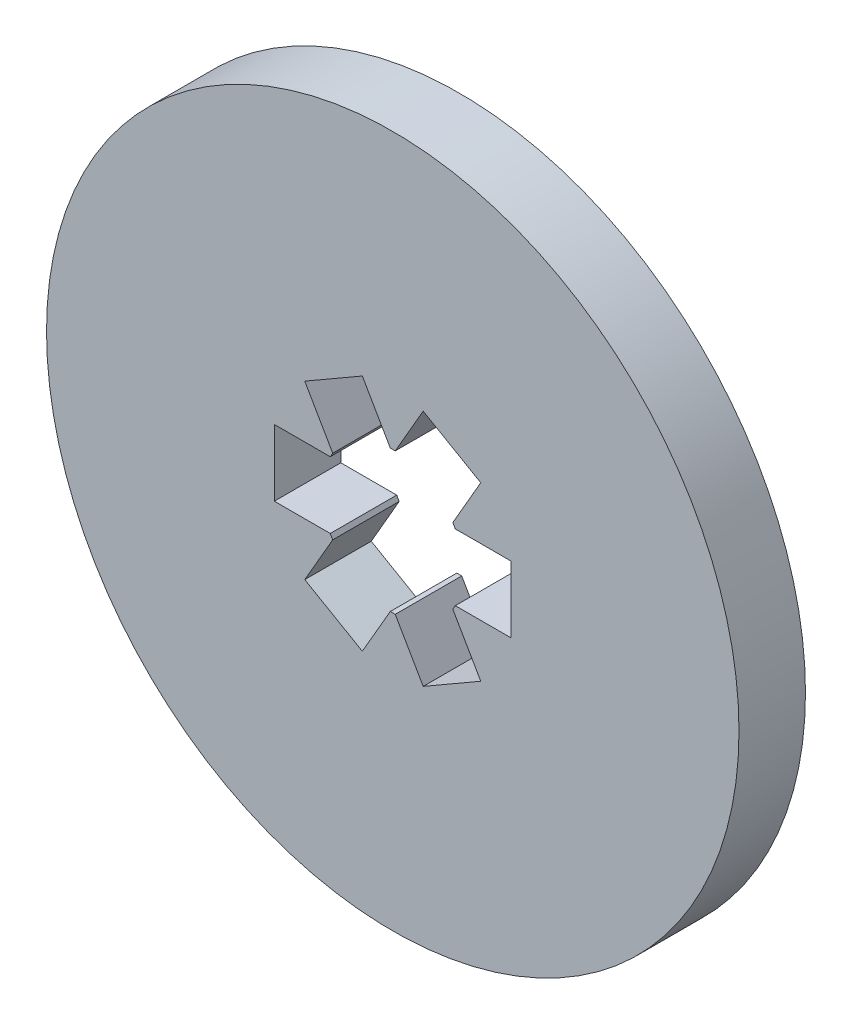
ISO-10303-21;
HEADER;
FILE_DESCRIPTION(('STEP AP214'),'2;1');
FILE_NAME('part.step','',(''),(''),'','','');
FILE_SCHEMA(('AUTOMOTIVE_DESIGN { 1 0 10303 214 1 1 1 1 }'));
ENDSEC;
DATA;
#1=APPLICATION_CONTEXT('core data for automotive mechanical design processes');
#2=APPLICATION_PROTOCOL_DEFINITION('international standard','automotive_design',2000,#1);
#3=PRODUCT_CONTEXT('',#1,'mechanical');
#4=PRODUCT('Part','Part','',(#3));
#5=PRODUCT_RELATED_PRODUCT_CATEGORY('part','',(#4));
#6=PRODUCT_DEFINITION_FORMATION('','',#4);
#7=PRODUCT_DEFINITION_CONTEXT('part definition',#1,'design');
#8=PRODUCT_DEFINITION('design','',#6,#7);
#9=PRODUCT_DEFINITION_SHAPE('','',#8);
#10=(LENGTH_UNIT() NAMED_UNIT(*) SI_UNIT(.MILLI.,.METRE.));
#11=(NAMED_UNIT(*) PLANE_ANGLE_UNIT() SI_UNIT($,.RADIAN.));
#12=(NAMED_UNIT(*) SI_UNIT($,.STERADIAN.) SOLID_ANGLE_UNIT());
#13=UNCERTAINTY_MEASURE_WITH_UNIT(LENGTH_MEASURE(1.E-05),#10,'distance_accuracy_value','');
#14=(GEOMETRIC_REPRESENTATION_CONTEXT(3) GLOBAL_UNCERTAINTY_ASSIGNED_CONTEXT((#13)) GLOBAL_UNIT_ASSIGNED_CONTEXT((#10,
#11,#12)) REPRESENTATION_CONTEXT('',''));
#15=CARTESIAN_POINT('',(0.,0.,0.));
#16=DIRECTION('',(0.,0.,1.));
#17=DIRECTION('',(1.,0.,0.));
#18=AXIS2_PLACEMENT_3D('',#15,#16,#17);
#19=CARTESIAN_POINT('',(107.492585866147,-0.762000000000165,1.524));
#20=DIRECTION('',(0.,0.,1.));
#21=DIRECTION('',(1.,0.,0.));
#22=AXIS2_PLACEMENT_3D('',#19,#20,#21);
#23=PLANE('',#22);
#24=CARTESIAN_POINT('',(107.492585866147,-0.762000000000165,1.524));
#25=DIRECTION('',(0.,0.,1.));
#26=DIRECTION('',(1.,0.,0.));
#27=AXIS2_PLACEMENT_3D('',#24,#25,#26);
#28=CIRCLE('',#27,7.93749999999999);
#29=CARTESIAN_POINT('',(99.5550858661466,-0.762000000000165,1.524));
#30=VERTEX_POINT('',#29);
#31=EDGE_CURVE('E11',#30,#30,#28,.T.);
#32=ORIENTED_EDGE('',*,*,#31,.T.);
#33=EDGE_LOOP('',(#32));
#34=FACE_BOUND('',#33,.T.);
#35=DIRECTION('',(-0.500000000001559,0.866025403783539,0.));
#36=VECTOR('',#35,1.);
#37=CARTESIAN_POINT('',(108.869130968628,0.0982460564084853,1.524));
#38=LINE('',#37,#36);
#39=CARTESIAN_POINT('',(108.925853355743,0.,1.524));
#40=VERTEX_POINT('',#39);
#41=CARTESIAN_POINT('',(108.869130968628,0.0982460564084853,1.524));
#42=VERTEX_POINT('',#41);
#43=EDGE_CURVE('E201',#40,#42,#38,.T.);
#44=ORIENTED_EDGE('',*,*,#43,.F.);
#45=DIRECTION('',(-1.,0.,0.));
#46=VECTOR('',#45,1.);
#47=CARTESIAN_POINT('',(108.925853355743,0.,1.524));
#48=LINE('',#47,#46);
#49=CARTESIAN_POINT('',(110.207675722449,0.,1.524));
#50=VERTEX_POINT('',#49);
#51=EDGE_CURVE('E193',#50,#40,#48,.T.);
#52=ORIENTED_EDGE('',*,*,#51,.F.);
#53=DIRECTION('',(0.,1.,0.));
#54=VECTOR('',#53,1.);
#55=CARTESIAN_POINT('',(110.207675722449,0.,1.524));
#56=LINE('',#55,#54);
#57=CARTESIAN_POINT('',(110.207675722449,-1.52399999999999,1.524));
#58=VERTEX_POINT('',#57);
#59=EDGE_CURVE('E257',#58,#50,#56,.T.);
#60=ORIENTED_EDGE('',*,*,#59,.F.);
#61=DIRECTION('',(1.,0.,0.));
#62=VECTOR('',#61,1.);
#63=CARTESIAN_POINT('',(110.207675722449,-1.52399999999999,1.524));
#64=LINE('',#63,#62);
#65=CARTESIAN_POINT('',(108.925853355743,-1.52399999999999,1.524));
#66=VERTEX_POINT('',#65);
#67=EDGE_CURVE('E255',#66,#58,#64,.T.);
#68=ORIENTED_EDGE('',*,*,#67,.F.);
#69=DIRECTION('',(0.499999999998682,0.866025403785199,0.));
#70=VECTOR('',#69,1.);
#71=CARTESIAN_POINT('',(108.925853355743,-1.52399999999999,1.524));
#72=LINE('',#71,#70);
#73=CARTESIAN_POINT('',(108.869130968628,-1.62224605640869,1.524));
#74=VERTEX_POINT('',#73);
#75=EDGE_CURVE('E253',#74,#66,#72,.T.);
#76=ORIENTED_EDGE('',*,*,#75,.F.);
#77=DIRECTION('',(-0.499999999999997,0.866025403784441,0.));
#78=VECTOR('',#77,1.);
#79=CARTESIAN_POINT('',(108.869130968628,-1.62224605640869,1.524));
#80=LINE('',#79,#78);
#81=CARTESIAN_POINT('',(109.510042151982,-2.7323367891159,1.524));
#82=VERTEX_POINT('',#81);
#83=EDGE_CURVE('E251',#82,#74,#80,.T.);
#84=ORIENTED_EDGE('',*,*,#83,.F.);
#85=DIRECTION('',(0.866025403784439,0.499999999999999,0.));
#86=VECTOR('',#85,1.);
#87=CARTESIAN_POINT('',(109.510042151982,-2.7323367891159,1.524));
#88=LINE('',#87,#86);
#89=CARTESIAN_POINT('',(108.190219436614,-3.4943367891159,1.524));
#90=VERTEX_POINT('',#89);
#91=EDGE_CURVE('E249',#90,#82,#88,.T.);
#92=ORIENTED_EDGE('',*,*,#91,.F.);
#93=DIRECTION('',(0.499999999999997,-0.866025403784441,0.));
#94=VECTOR('',#93,1.);
#95=CARTESIAN_POINT('',(108.190219436614,-3.4943367891159,1.524));
#96=LINE('',#95,#94);
#97=CARTESIAN_POINT('',(107.549308253261,-2.38424605640869,1.524));
#98=VERTEX_POINT('',#97);
#99=EDGE_CURVE('E247',#98,#90,#96,.T.);
#100=ORIENTED_EDGE('',*,*,#99,.F.);
#101=DIRECTION('',(1.,1.59030015025616E-12,0.));
#102=VECTOR('',#101,1.);
#103=CARTESIAN_POINT('',(107.549308253261,-2.38424605640869,1.524));
#104=LINE('',#103,#102);
#105=CARTESIAN_POINT('',(107.435863479032,-2.38424605640887,1.524));
#106=VERTEX_POINT('',#105);
#107=EDGE_CURVE('E245',#106,#98,#104,.T.);
#108=ORIENTED_EDGE('',*,*,#107,.F.);
#109=DIRECTION('',(0.500000000000001,0.866025403784438,0.));
#110=VECTOR('',#109,1.);
#111=CARTESIAN_POINT('',(107.435863479032,-2.38424605640887,1.524));
#112=LINE('',#111,#110);
#113=CARTESIAN_POINT('',(106.794952295679,-3.49433678911606,1.524));
#114=VERTEX_POINT('',#113);
#115=EDGE_CURVE('E243',#114,#106,#112,.T.);
#116=ORIENTED_EDGE('',*,*,#115,.F.);
#117=DIRECTION('',(0.866025403784433,-0.50000000000001,0.));
#118=VECTOR('',#117,1.);
#119=CARTESIAN_POINT('',(106.794952295679,-3.49433678911606,1.524));
#120=LINE('',#119,#118);
#121=CARTESIAN_POINT('',(105.475129580311,-2.73233678911605,1.524));
#122=VERTEX_POINT('',#121);
#123=EDGE_CURVE('E241',#122,#114,#120,.T.);
#124=ORIENTED_EDGE('',*,*,#123,.F.);
#125=DIRECTION('',(-0.500000000000001,-0.866025403784438,0.));
#126=VECTOR('',#125,1.);
#127=CARTESIAN_POINT('',(105.475129580311,-2.73233678911605,1.524));
#128=LINE('',#127,#126);
#129=CARTESIAN_POINT('',(106.116040763665,-1.62224605640886,1.524));
#130=VERTEX_POINT('',#129);
#131=EDGE_CURVE('E239',#130,#122,#128,.T.);
#132=ORIENTED_EDGE('',*,*,#131,.F.);
#133=DIRECTION('',(0.500000000001185,-0.866025403783754,0.));
#134=VECTOR('',#133,1.);
#135=CARTESIAN_POINT('',(106.116040763665,-1.62224605640886,1.524));
#136=LINE('',#135,#134);
#137=CARTESIAN_POINT('',(106.05931837655,-1.52400000000036,1.524));
#138=VERTEX_POINT('',#137);
#139=EDGE_CURVE('E237',#138,#130,#136,.T.);
#140=ORIENTED_EDGE('',*,*,#139,.F.);
#141=DIRECTION('',(1.,0.,0.));
#142=VECTOR('',#141,1.);
#143=CARTESIAN_POINT('',(106.05931837655,-1.52400000000036,1.524));
#144=LINE('',#143,#142);
#145=CARTESIAN_POINT('',(104.777496009844,-1.52400000000037,1.524));
#146=VERTEX_POINT('',#145);
#147=EDGE_CURVE('E235',#146,#138,#144,.T.);
#148=ORIENTED_EDGE('',*,*,#147,.F.);
#149=DIRECTION('',(0.,-1.,0.));
#150=VECTOR('',#149,1.);
#151=CARTESIAN_POINT('',(104.777496009844,-1.52400000000037,1.524));
#152=LINE('',#151,#150);
#153=CARTESIAN_POINT('',(104.777496009844,-3.64725610824124E-13,1.524));
#154=VERTEX_POINT('',#153);
#155=EDGE_CURVE('E233',#154,#146,#152,.T.);
#156=ORIENTED_EDGE('',*,*,#155,.F.);
#157=DIRECTION('',(-1.,0.,0.));
#158=VECTOR('',#157,1.);
#159=CARTESIAN_POINT('',(104.777496009844,-3.64725610824124E-13,1.524));
#160=LINE('',#159,#158);
#161=CARTESIAN_POINT('',(106.05931837655,-3.55618312575245E-13,1.524));
#162=VERTEX_POINT('',#161);
#163=EDGE_CURVE('E231',#162,#154,#160,.T.);
#164=ORIENTED_EDGE('',*,*,#163,.F.);
#165=DIRECTION('',(-0.499999999998743,-0.866025403785164,0.));
#166=VECTOR('',#165,1.);
#167=CARTESIAN_POINT('',(106.05931837655,-3.55618312575245E-13,1.524));
#168=LINE('',#167,#166);
#169=CARTESIAN_POINT('',(106.116040763665,0.0982460564083049,1.524));
#170=VERTEX_POINT('',#169);
#171=EDGE_CURVE('E229',#170,#162,#168,.T.);
#172=ORIENTED_EDGE('',*,*,#171,.F.);
#173=DIRECTION('',(0.500000000000001,-0.866025403784438,0.));
#174=VECTOR('',#173,1.);
#175=CARTESIAN_POINT('',(106.116040763665,0.0982460564083049,1.524));
#176=LINE('',#175,#174);
#177=CARTESIAN_POINT('',(105.475129580311,1.2083367891155,1.524));
#178=VERTEX_POINT('',#177);
#179=EDGE_CURVE('E227',#178,#170,#176,.T.);
#180=ORIENTED_EDGE('',*,*,#179,.F.);
#181=DIRECTION('',(-0.866025403784435,-0.500000000000006,0.));
#182=VECTOR('',#181,1.);
#183=CARTESIAN_POINT('',(105.475129580311,1.2083367891155,1.524));
#184=LINE('',#183,#182);
#185=CARTESIAN_POINT('',(106.794952295679,1.97033678911551,1.524));
#186=VERTEX_POINT('',#185);
#187=EDGE_CURVE('E225',#186,#178,#184,.T.);
#188=ORIENTED_EDGE('',*,*,#187,.F.);
#189=DIRECTION('',(-0.500000000000001,0.866025403784438,0.));
#190=VECTOR('',#189,1.);
#191=CARTESIAN_POINT('',(106.794952295679,1.97033678911551,1.524));
#192=LINE('',#191,#190);
#193=CARTESIAN_POINT('',(107.435863479032,0.860246056408318,1.524));
#194=VERTEX_POINT('',#193);
#195=EDGE_CURVE('E223',#194,#186,#192,.T.);
#196=ORIENTED_EDGE('',*,*,#195,.F.);
#197=DIRECTION('',(-1.,-1.46796936946758E-12,0.));
#198=VECTOR('',#197,1.);
#199=CARTESIAN_POINT('',(107.435863479032,0.860246056408318,1.524));
#200=LINE('',#199,#198);
#201=CARTESIAN_POINT('',(107.549308253261,0.860246056408484,1.524));
#202=VERTEX_POINT('',#201);
#203=EDGE_CURVE('E221',#202,#194,#200,.T.);
#204=ORIENTED_EDGE('',*,*,#203,.F.);
#205=DIRECTION('',(-0.499999999999997,-0.866025403784441,0.));
#206=VECTOR('',#205,1.);
#207=CARTESIAN_POINT('',(107.549308253261,0.860246056408484,1.524));
#208=LINE('',#207,#206);
#209=CARTESIAN_POINT('',(108.190219436614,1.97033678911569,1.524));
#210=VERTEX_POINT('',#209);
#211=EDGE_CURVE('E219',#210,#202,#208,.T.);
#212=ORIENTED_EDGE('',*,*,#211,.F.);
#213=DIRECTION('',(-0.866025403784439,0.499999999999999,0.));
#214=VECTOR('',#213,1.);
#215=CARTESIAN_POINT('',(108.190219436614,1.97033678911569,1.524));
#216=LINE('',#215,#214);
#217=CARTESIAN_POINT('',(109.510042151982,1.20833678911569,1.524));
#218=VERTEX_POINT('',#217);
#219=EDGE_CURVE('E215',#218,#210,#216,.T.);
#220=ORIENTED_EDGE('',*,*,#219,.F.);
#221=DIRECTION('',(0.499999999999997,0.866025403784441,0.));
#222=VECTOR('',#221,1.);
#223=CARTESIAN_POINT('',(109.510042151982,1.20833678911569,1.524));
#224=LINE('',#223,#222);
#225=EDGE_CURVE('E213',#42,#218,#224,.T.);
#226=ORIENTED_EDGE('',*,*,#225,.F.);
#227=EDGE_LOOP('',(#44,#52,#60,#68,#76,#84,#92,#100,#108,#116,#124,#132,#140,#148,#156,#164,
#172,#180,#188,#196,#204,#212,#220,#226));
#228=FACE_BOUND('',#227,.T.);
#229=ADVANCED_FACE('F32',(#34,#228),#23,.T.);
#230=CARTESIAN_POINT('',(107.492585866147,-0.762000000000165,0.));
#231=DIRECTION('',(0.,0.,1.));
#232=DIRECTION('',(1.,0.,0.));
#233=AXIS2_PLACEMENT_3D('',#230,#231,#232);
#234=PLANE('',#233);
#235=CARTESIAN_POINT('',(107.492585866147,-0.762000000000165,0.));
#236=DIRECTION('',(0.,0.,1.));
#237=DIRECTION('',(1.,0.,0.));
#238=AXIS2_PLACEMENT_3D('',#235,#236,#237);
#239=CIRCLE('',#238,7.93749999999999);
#240=CARTESIAN_POINT('',(99.5550858661466,-0.762000000000165,0.));
#241=VERTEX_POINT('',#240);
#242=EDGE_CURVE('E36',#241,#241,#239,.T.);
#243=ORIENTED_EDGE('',*,*,#242,.F.);
#244=EDGE_LOOP('',(#243));
#245=FACE_BOUND('',#244,.T.);
#246=DIRECTION('',(-1.,0.,0.));
#247=VECTOR('',#246,1.);
#248=CARTESIAN_POINT('',(108.925853355743,0.,0.));
#249=LINE('',#248,#247);
#250=CARTESIAN_POINT('',(110.207675722449,0.,0.));
#251=VERTEX_POINT('',#250);
#252=CARTESIAN_POINT('',(108.925853355743,0.,0.));
#253=VERTEX_POINT('',#252);
#254=EDGE_CURVE('E55',#251,#253,#249,.T.);
#255=ORIENTED_EDGE('',*,*,#254,.T.);
#256=DIRECTION('',(-0.500000000001559,0.866025403783539,0.));
#257=VECTOR('',#256,1.);
#258=CARTESIAN_POINT('',(108.869130968628,0.0982460564084853,0.));
#259=LINE('',#258,#257);
#260=CARTESIAN_POINT('',(108.869130968628,0.0982460564084853,0.));
#261=VERTEX_POINT('',#260);
#262=EDGE_CURVE('E208',#253,#261,#259,.T.);
#263=ORIENTED_EDGE('',*,*,#262,.T.);
#264=DIRECTION('',(0.499999999999997,0.866025403784441,0.));
#265=VECTOR('',#264,1.);
#266=CARTESIAN_POINT('',(109.510042151982,1.20833678911569,0.));
#267=LINE('',#266,#265);
#268=CARTESIAN_POINT('',(109.510042151982,1.20833678911569,0.));
#269=VERTEX_POINT('',#268);
#270=EDGE_CURVE('E261',#261,#269,#267,.T.);
#271=ORIENTED_EDGE('',*,*,#270,.T.);
#272=DIRECTION('',(-0.866025403784439,0.499999999999999,0.));
#273=VECTOR('',#272,1.);
#274=CARTESIAN_POINT('',(108.190219436614,1.97033678911569,0.));
#275=LINE('',#274,#273);
#276=CARTESIAN_POINT('',(108.190219436614,1.97033678911569,0.));
#277=VERTEX_POINT('',#276);
#278=EDGE_CURVE('E264',#269,#277,#275,.T.);
#279=ORIENTED_EDGE('',*,*,#278,.T.);
#280=DIRECTION('',(-0.499999999999997,-0.866025403784441,0.));
#281=VECTOR('',#280,1.);
#282=CARTESIAN_POINT('',(107.549308253261,0.860246056408484,0.));
#283=LINE('',#282,#281);
#284=CARTESIAN_POINT('',(107.549308253261,0.860246056408484,0.));
#285=VERTEX_POINT('',#284);
#286=EDGE_CURVE('E267',#277,#285,#283,.T.);
#287=ORIENTED_EDGE('',*,*,#286,.T.);
#288=DIRECTION('',(-1.,-1.46796936946758E-12,0.));
#289=VECTOR('',#288,1.);
#290=CARTESIAN_POINT('',(107.435863479032,0.860246056408318,0.));
#291=LINE('',#290,#289);
#292=CARTESIAN_POINT('',(107.435863479032,0.860246056408318,0.));
#293=VERTEX_POINT('',#292);
#294=EDGE_CURVE('E270',#285,#293,#291,.T.);
#295=ORIENTED_EDGE('',*,*,#294,.T.);
#296=DIRECTION('',(-0.500000000000001,0.866025403784438,0.));
#297=VECTOR('',#296,1.);
#298=CARTESIAN_POINT('',(106.794952295679,1.97033678911551,0.));
#299=LINE('',#298,#297);
#300=CARTESIAN_POINT('',(106.794952295679,1.97033678911551,0.));
#301=VERTEX_POINT('',#300);
#302=EDGE_CURVE('E273',#293,#301,#299,.T.);
#303=ORIENTED_EDGE('',*,*,#302,.T.);
#304=DIRECTION('',(-0.866025403784435,-0.500000000000006,0.));
#305=VECTOR('',#304,1.);
#306=CARTESIAN_POINT('',(105.475129580311,1.2083367891155,0.));
#307=LINE('',#306,#305);
#308=CARTESIAN_POINT('',(105.475129580311,1.2083367891155,0.));
#309=VERTEX_POINT('',#308);
#310=EDGE_CURVE('E276',#301,#309,#307,.T.);
#311=ORIENTED_EDGE('',*,*,#310,.T.);
#312=DIRECTION('',(0.500000000000001,-0.866025403784438,0.));
#313=VECTOR('',#312,1.);
#314=CARTESIAN_POINT('',(106.116040763665,0.0982460564083049,0.));
#315=LINE('',#314,#313);
#316=CARTESIAN_POINT('',(106.116040763665,0.0982460564083049,0.));
#317=VERTEX_POINT('',#316);
#318=EDGE_CURVE('E279',#309,#317,#315,.T.);
#319=ORIENTED_EDGE('',*,*,#318,.T.);
#320=DIRECTION('',(-0.499999999998743,-0.866025403785164,0.));
#321=VECTOR('',#320,1.);
#322=CARTESIAN_POINT('',(106.05931837655,-3.55618312575245E-13,0.));
#323=LINE('',#322,#321);
#324=CARTESIAN_POINT('',(106.05931837655,-3.55618312575245E-13,0.));
#325=VERTEX_POINT('',#324);
#326=EDGE_CURVE('E282',#317,#325,#323,.T.);
#327=ORIENTED_EDGE('',*,*,#326,.T.);
#328=DIRECTION('',(-1.,0.,0.));
#329=VECTOR('',#328,1.);
#330=CARTESIAN_POINT('',(104.777496009844,-3.64725610824124E-13,0.));
#331=LINE('',#330,#329);
#332=CARTESIAN_POINT('',(104.777496009844,-3.64725610824124E-13,0.));
#333=VERTEX_POINT('',#332);
#334=EDGE_CURVE('E285',#325,#333,#331,.T.);
#335=ORIENTED_EDGE('',*,*,#334,.T.);
#336=DIRECTION('',(0.,-1.,0.));
#337=VECTOR('',#336,1.);
#338=CARTESIAN_POINT('',(104.777496009844,-1.52400000000037,0.));
#339=LINE('',#338,#337);
#340=CARTESIAN_POINT('',(104.777496009844,-1.52400000000037,0.));
#341=VERTEX_POINT('',#340);
#342=EDGE_CURVE('E288',#333,#341,#339,.T.);
#343=ORIENTED_EDGE('',*,*,#342,.T.);
#344=DIRECTION('',(1.,0.,0.));
#345=VECTOR('',#344,1.);
#346=CARTESIAN_POINT('',(106.05931837655,-1.52400000000036,0.));
#347=LINE('',#346,#345);
#348=CARTESIAN_POINT('',(106.05931837655,-1.52400000000036,0.));
#349=VERTEX_POINT('',#348);
#350=EDGE_CURVE('E291',#341,#349,#347,.T.);
#351=ORIENTED_EDGE('',*,*,#350,.T.);
#352=DIRECTION('',(0.500000000001185,-0.866025403783754,0.));
#353=VECTOR('',#352,1.);
#354=CARTESIAN_POINT('',(106.116040763665,-1.62224605640886,0.));
#355=LINE('',#354,#353);
#356=CARTESIAN_POINT('',(106.116040763665,-1.62224605640886,0.));
#357=VERTEX_POINT('',#356);
#358=EDGE_CURVE('E294',#349,#357,#355,.T.);
#359=ORIENTED_EDGE('',*,*,#358,.T.);
#360=DIRECTION('',(-0.500000000000001,-0.866025403784438,0.));
#361=VECTOR('',#360,1.);
#362=CARTESIAN_POINT('',(105.475129580311,-2.73233678911605,0.));
#363=LINE('',#362,#361);
#364=CARTESIAN_POINT('',(105.475129580311,-2.73233678911605,0.));
#365=VERTEX_POINT('',#364);
#366=EDGE_CURVE('E297',#357,#365,#363,.T.);
#367=ORIENTED_EDGE('',*,*,#366,.T.);
#368=DIRECTION('',(0.866025403784433,-0.50000000000001,0.));
#369=VECTOR('',#368,1.);
#370=CARTESIAN_POINT('',(106.794952295679,-3.49433678911606,0.));
#371=LINE('',#370,#369);
#372=CARTESIAN_POINT('',(106.794952295679,-3.49433678911606,0.));
#373=VERTEX_POINT('',#372);
#374=EDGE_CURVE('E300',#365,#373,#371,.T.);
#375=ORIENTED_EDGE('',*,*,#374,.T.);
#376=DIRECTION('',(0.500000000000001,0.866025403784438,0.));
#377=VECTOR('',#376,1.);
#378=CARTESIAN_POINT('',(107.435863479032,-2.38424605640887,0.));
#379=LINE('',#378,#377);
#380=CARTESIAN_POINT('',(107.435863479032,-2.38424605640887,0.));
#381=VERTEX_POINT('',#380);
#382=EDGE_CURVE('E303',#373,#381,#379,.T.);
#383=ORIENTED_EDGE('',*,*,#382,.T.);
#384=DIRECTION('',(1.,1.59030015025616E-12,0.));
#385=VECTOR('',#384,1.);
#386=CARTESIAN_POINT('',(107.549308253261,-2.38424605640869,0.));
#387=LINE('',#386,#385);
#388=CARTESIAN_POINT('',(107.549308253261,-2.38424605640869,0.));
#389=VERTEX_POINT('',#388);
#390=EDGE_CURVE('E306',#381,#389,#387,.T.);
#391=ORIENTED_EDGE('',*,*,#390,.T.);
#392=DIRECTION('',(0.499999999999997,-0.866025403784441,0.));
#393=VECTOR('',#392,1.);
#394=CARTESIAN_POINT('',(108.190219436614,-3.4943367891159,0.));
#395=LINE('',#394,#393);
#396=CARTESIAN_POINT('',(108.190219436614,-3.4943367891159,0.));
#397=VERTEX_POINT('',#396);
#398=EDGE_CURVE('E309',#389,#397,#395,.T.);
#399=ORIENTED_EDGE('',*,*,#398,.T.);
#400=DIRECTION('',(0.866025403784439,0.499999999999999,0.));
#401=VECTOR('',#400,1.);
#402=CARTESIAN_POINT('',(109.510042151982,-2.7323367891159,0.));
#403=LINE('',#402,#401);
#404=CARTESIAN_POINT('',(109.510042151982,-2.7323367891159,0.));
#405=VERTEX_POINT('',#404);
#406=EDGE_CURVE('E312',#397,#405,#403,.T.);
#407=ORIENTED_EDGE('',*,*,#406,.T.);
#408=DIRECTION('',(-0.499999999999997,0.866025403784441,0.));
#409=VECTOR('',#408,1.);
#410=CARTESIAN_POINT('',(108.869130968628,-1.62224605640869,0.));
#411=LINE('',#410,#409);
#412=CARTESIAN_POINT('',(108.869130968628,-1.62224605640869,0.));
#413=VERTEX_POINT('',#412);
#414=EDGE_CURVE('E315',#405,#413,#411,.T.);
#415=ORIENTED_EDGE('',*,*,#414,.T.);
#416=DIRECTION('',(0.499999999998682,0.866025403785199,0.));
#417=VECTOR('',#416,1.);
#418=CARTESIAN_POINT('',(108.925853355743,-1.52399999999999,0.));
#419=LINE('',#418,#417);
#420=CARTESIAN_POINT('',(108.925853355743,-1.52399999999999,0.));
#421=VERTEX_POINT('',#420);
#422=EDGE_CURVE('E318',#413,#421,#419,.T.);
#423=ORIENTED_EDGE('',*,*,#422,.T.);
#424=DIRECTION('',(1.,0.,0.));
#425=VECTOR('',#424,1.);
#426=CARTESIAN_POINT('',(110.207675722449,-1.52399999999999,0.));
#427=LINE('',#426,#425);
#428=CARTESIAN_POINT('',(110.207675722449,-1.52399999999999,0.));
#429=VERTEX_POINT('',#428);
#430=EDGE_CURVE('E321',#421,#429,#427,.T.);
#431=ORIENTED_EDGE('',*,*,#430,.T.);
#432=DIRECTION('',(0.,1.,0.));
#433=VECTOR('',#432,1.);
#434=CARTESIAN_POINT('',(110.207675722449,0.,0.));
#435=LINE('',#434,#433);
#436=EDGE_CURVE('E202',#429,#251,#435,.T.);
#437=ORIENTED_EDGE('',*,*,#436,.T.);
#438=EDGE_LOOP('',(#255,#263,#271,#279,#287,#295,#303,#311,#319,#327,#335,#343,#351,#359,#367,
#375,#383,#391,#399,#407,#415,#423,#431,#437));
#439=FACE_BOUND('',#438,.T.);
#440=ADVANCED_FACE('F374',(#245,#439),#234,.F.);
#441=CARTESIAN_POINT('',(107.492585866147,-0.762000000000165,1.524));
#442=DIRECTION('',(0.,0.,-1.));
#443=DIRECTION('',(-1.,0.,0.));
#444=AXIS2_PLACEMENT_3D('',#441,#442,#443);
#445=CYLINDRICAL_SURFACE('',#444,7.93749999999999);
#446=CARTESIAN_POINT('',(99.5550858661466,-0.762000000000165,1.524));
#447=CARTESIAN_POINT('',(99.5550858661466,-0.762000000000165,1.508125));
#448=CARTESIAN_POINT('',(99.5550858661466,-0.762000000000165,1.49225));
#449=CARTESIAN_POINT('',(99.5550858661466,-0.762000000000165,1.4605));
#450=CARTESIAN_POINT('',(99.5550858661466,-0.762000000000165,1.444625));
#451=CARTESIAN_POINT('',(99.5550858661466,-0.762000000000165,1.412875));
#452=CARTESIAN_POINT('',(99.5550858661466,-0.762000000000165,1.397));
#453=CARTESIAN_POINT('',(99.5550858661466,-0.762000000000165,1.36525));
#454=CARTESIAN_POINT('',(99.5550858661466,-0.762000000000165,1.349375));
#455=CARTESIAN_POINT('',(99.5550858661466,-0.762000000000165,1.317625));
#456=CARTESIAN_POINT('',(99.5550858661466,-0.762000000000165,1.30175));
#457=CARTESIAN_POINT('',(99.5550858661466,-0.762000000000165,1.27));
#458=CARTESIAN_POINT('',(99.5550858661466,-0.762000000000165,1.254125));
#459=CARTESIAN_POINT('',(99.5550858661466,-0.762000000000165,1.222375));
#460=CARTESIAN_POINT('',(99.5550858661466,-0.762000000000165,1.2065));
#461=CARTESIAN_POINT('',(99.5550858661466,-0.762000000000165,1.17475));
#462=CARTESIAN_POINT('',(99.5550858661466,-0.762000000000165,1.158875));
#463=CARTESIAN_POINT('',(99.5550858661466,-0.762000000000165,1.127125));
#464=CARTESIAN_POINT('',(99.5550858661466,-0.762000000000165,1.11125));
#465=CARTESIAN_POINT('',(99.5550858661466,-0.762000000000165,1.0795));
#466=CARTESIAN_POINT('',(99.5550858661466,-0.762000000000165,1.063625));
#467=CARTESIAN_POINT('',(99.5550858661466,-0.762000000000165,1.031875));
#468=CARTESIAN_POINT('',(99.5550858661466,-0.762000000000165,1.016));
#469=CARTESIAN_POINT('',(99.5550858661466,-0.762000000000165,0.98425));
#470=CARTESIAN_POINT('',(99.5550858661466,-0.762000000000165,0.968375));
#471=CARTESIAN_POINT('',(99.5550858661466,-0.762000000000165,0.936625));
#472=CARTESIAN_POINT('',(99.5550858661466,-0.762000000000165,0.92075));
#473=CARTESIAN_POINT('',(99.5550858661466,-0.762000000000165,0.889));
#474=CARTESIAN_POINT('',(99.5550858661466,-0.762000000000165,0.873125));
#475=CARTESIAN_POINT('',(99.5550858661466,-0.762000000000165,0.841375));
#476=CARTESIAN_POINT('',(99.5550858661466,-0.762000000000165,0.8255));
#477=CARTESIAN_POINT('',(99.5550858661466,-0.762000000000165,0.79375));
#478=CARTESIAN_POINT('',(99.5550858661466,-0.762000000000165,0.777875));
#479=CARTESIAN_POINT('',(99.5550858661466,-0.762000000000165,0.746125));
#480=CARTESIAN_POINT('',(99.5550858661466,-0.762000000000165,0.73025));
#481=CARTESIAN_POINT('',(99.5550858661466,-0.762000000000165,0.6985));
#482=CARTESIAN_POINT('',(99.5550858661466,-0.762000000000165,0.682625));
#483=CARTESIAN_POINT('',(99.5550858661466,-0.762000000000165,0.650875));
#484=CARTESIAN_POINT('',(99.5550858661466,-0.762000000000165,0.635));
#485=CARTESIAN_POINT('',(99.5550858661466,-0.762000000000165,0.60325));
#486=CARTESIAN_POINT('',(99.5550858661466,-0.762000000000165,0.587375));
#487=CARTESIAN_POINT('',(99.5550858661466,-0.762000000000165,0.555625));
#488=CARTESIAN_POINT('',(99.5550858661466,-0.762000000000165,0.53975));
#489=CARTESIAN_POINT('',(99.5550858661466,-0.762000000000165,0.508));
#490=CARTESIAN_POINT('',(99.5550858661466,-0.762000000000165,0.492125));
#491=CARTESIAN_POINT('',(99.5550858661466,-0.762000000000165,0.460375));
#492=CARTESIAN_POINT('',(99.5550858661466,-0.762000000000165,0.4445));
#493=CARTESIAN_POINT('',(99.5550858661466,-0.762000000000165,0.41275));
#494=CARTESIAN_POINT('',(99.5550858661466,-0.762000000000165,0.396875));
#495=CARTESIAN_POINT('',(99.5550858661466,-0.762000000000165,0.365125));
#496=CARTESIAN_POINT('',(99.5550858661466,-0.762000000000165,0.34925));
#497=CARTESIAN_POINT('',(99.5550858661466,-0.762000000000165,0.3175));
#498=CARTESIAN_POINT('',(99.5550858661466,-0.762000000000165,0.301625));
#499=CARTESIAN_POINT('',(99.5550858661466,-0.762000000000165,0.269875));
#500=CARTESIAN_POINT('',(99.5550858661466,-0.762000000000165,0.254));
#501=CARTESIAN_POINT('',(99.5550858661466,-0.762000000000165,0.22225));
#502=CARTESIAN_POINT('',(99.5550858661466,-0.762000000000165,0.206375));
#503=CARTESIAN_POINT('',(99.5550858661466,-0.762000000000165,0.174625));
#504=CARTESIAN_POINT('',(99.5550858661466,-0.762000000000165,0.15875));
#505=CARTESIAN_POINT('',(99.5550858661466,-0.762000000000165,0.127));
#506=CARTESIAN_POINT('',(99.5550858661466,-0.762000000000165,0.111125));
#507=CARTESIAN_POINT('',(99.5550858661466,-0.762000000000165,0.079375));
#508=CARTESIAN_POINT('',(99.5550858661466,-0.762000000000165,0.0635));
#509=CARTESIAN_POINT('',(99.5550858661466,-0.762000000000165,0.0317499999999999));
#510=CARTESIAN_POINT('',(99.5550858661466,-0.762000000000165,0.015875));
#511=CARTESIAN_POINT('',(99.5550858661466,-0.762000000000165,0.));
#512=B_SPLINE_CURVE_WITH_KNOTS('',3,(#446,#447,#448,#449,#450,#451,#452,#453,#454,#455,#456,
#457,#458,#459,#460,#461,#462,#463,#464,#465,#466,#467,#468,#469,#470,#471,#472,#473,#474,#475,
#476,#477,#478,#479,#480,#481,#482,#483,#484,#485,#486,#487,#488,#489,#490,#491,#492,#493,#494,
#495,#496,#497,#498,#499,#500,#501,#502,#503,#504,#505,#506,#507,#508,#509,#510,#511),
.UNSPECIFIED.,.F.,.F.,(4,2,2,2,2,2,2,2,2,2,2,2,2,2,2,2,2,2,2,2,2,2,2,2,2,2,2,2,2,2,2,2,4),(0.,
0.0476250000000001,0.0952500000000001,0.142875,0.1905,0.238125,0.28575,0.333375,0.381,0.428625,
0.47625,0.523875,0.5715,0.619125,0.66675,0.714375,0.762,0.809625,0.85725,0.904875,0.9525,
1.000125,1.04775,1.095375,1.143,1.190625,1.23825,1.285875,1.3335,1.381125,1.42875,1.476375,
1.524),.UNSPECIFIED.);
#513=EDGE_CURVE('BSEAM34',#30,#241,#512,.T.);
#514=ORIENTED_EDGE('',*,*,#31,.F.);
#515=ORIENTED_EDGE('',*,*,#242,.T.);
#516=ORIENTED_EDGE('',*,*,#513,.T.);
#517=ORIENTED_EDGE('',*,*,#513,.F.);
#518=EDGE_LOOP('',(#514,#516,#515,#517));
#519=FACE_BOUND('',#518,.T.);
#520=ADVANCED_FACE('F34',(#519),#445,.T.);
#521=CARTESIAN_POINT('',(108.925853355743,0.,1.524));
#522=DIRECTION('',(0.,-1.,0.));
#523=DIRECTION('',(1.,0.,0.));
#524=AXIS2_PLACEMENT_3D('',#521,#522,#523);
#525=PLANE('',#524);
#526=ORIENTED_EDGE('',*,*,#254,.F.);
#527=DIRECTION('',(0.,0.,-1.));
#528=VECTOR('',#527,1.);
#529=CARTESIAN_POINT('',(110.207675722449,0.,1.524));
#530=LINE('',#529,#528);
#531=EDGE_CURVE('E197',#50,#251,#530,.T.);
#532=ORIENTED_EDGE('',*,*,#531,.F.);
#533=ORIENTED_EDGE('',*,*,#51,.T.);
#534=DIRECTION('',(0.,0.,-1.));
#535=VECTOR('',#534,1.);
#536=CARTESIAN_POINT('',(108.925853355743,0.,1.524));
#537=LINE('',#536,#535);
#538=EDGE_CURVE('E196',#40,#253,#537,.T.);
#539=ORIENTED_EDGE('',*,*,#538,.T.);
#540=EDGE_LOOP('',(#526,#532,#533,#539));
#541=FACE_BOUND('',#540,.T.);
#542=ADVANCED_FACE('F195',(#541),#525,.T.);
#543=CARTESIAN_POINT('',(108.869130968628,0.0982460564084853,1.524));
#544=DIRECTION('',(-0.866025403783539,-0.500000000001559,0.));
#545=DIRECTION('',(0.500000000001559,-0.866025403783539,0.));
#546=AXIS2_PLACEMENT_3D('',#543,#544,#545);
#547=PLANE('',#546);
#548=ORIENTED_EDGE('',*,*,#262,.F.);
#549=ORIENTED_EDGE('',*,*,#538,.F.);
#550=ORIENTED_EDGE('',*,*,#43,.T.);
#551=DIRECTION('',(0.,0.,-1.));
#552=VECTOR('',#551,1.);
#553=CARTESIAN_POINT('',(108.869130968628,0.0982460564084853,1.524));
#554=LINE('',#553,#552);
#555=EDGE_CURVE('E209',#42,#261,#554,.T.);
#556=ORIENTED_EDGE('',*,*,#555,.T.);
#557=EDGE_LOOP('',(#548,#549,#550,#556));
#558=FACE_BOUND('',#557,.T.);
#559=ADVANCED_FACE('F205',(#558),#547,.T.);
#560=CARTESIAN_POINT('',(109.510042151982,1.20833678911569,1.524));
#561=DIRECTION('',(-0.866025403784441,0.499999999999996,0.));
#562=DIRECTION('',(-0.499999999999997,-0.866025403784441,0.));
#563=AXIS2_PLACEMENT_3D('',#560,#561,#562);
#564=PLANE('',#563);
#565=ORIENTED_EDGE('',*,*,#270,.F.);
#566=ORIENTED_EDGE('',*,*,#555,.F.);
#567=ORIENTED_EDGE('',*,*,#225,.T.);
#568=DIRECTION('',(0.,0.,-1.));
#569=VECTOR('',#568,1.);
#570=CARTESIAN_POINT('',(109.510042151982,1.20833678911569,1.524));
#571=LINE('',#570,#569);
#572=EDGE_CURVE('E366',#218,#269,#571,.T.);
#573=ORIENTED_EDGE('',*,*,#572,.T.);
#574=EDGE_LOOP('',(#565,#566,#567,#573));
#575=FACE_BOUND('',#574,.T.);
#576=ADVANCED_FACE('F370',(#575),#564,.T.);
#577=CARTESIAN_POINT('',(108.190219436614,1.97033678911569,1.524));
#578=DIRECTION('',(-0.499999999999999,-0.866025403784439,0.));
#579=DIRECTION('',(0.866025403784439,-0.499999999999999,0.));
#580=AXIS2_PLACEMENT_3D('',#577,#578,#579);
#581=PLANE('',#580);
#582=ORIENTED_EDGE('',*,*,#278,.F.);
#583=ORIENTED_EDGE('',*,*,#572,.F.);
#584=ORIENTED_EDGE('',*,*,#219,.T.);
#585=DIRECTION('',(0.,0.,-1.));
#586=VECTOR('',#585,1.);
#587=CARTESIAN_POINT('',(108.190219436614,1.97033678911569,1.524));
#588=LINE('',#587,#586);
#589=EDGE_CURVE('E364',#210,#277,#588,.T.);
#590=ORIENTED_EDGE('',*,*,#589,.T.);
#591=EDGE_LOOP('',(#582,#583,#584,#590));
#592=FACE_BOUND('',#591,.T.);
#593=ADVANCED_FACE('F472',(#592),#581,.T.);
#594=CARTESIAN_POINT('',(107.549308253261,0.860246056408484,1.524));
#595=DIRECTION('',(0.866025403784441,-0.499999999999996,0.));
#596=DIRECTION('',(0.499999999999997,0.866025403784441,0.));
#597=AXIS2_PLACEMENT_3D('',#594,#595,#596);
#598=PLANE('',#597);
#599=ORIENTED_EDGE('',*,*,#286,.F.);
#600=ORIENTED_EDGE('',*,*,#589,.F.);
#601=ORIENTED_EDGE('',*,*,#211,.T.);
#602=DIRECTION('',(0.,0.,-1.));
#603=VECTOR('',#602,1.);
#604=CARTESIAN_POINT('',(107.549308253261,0.860246056408484,1.524));
#605=LINE('',#604,#603);
#606=EDGE_CURVE('E362',#202,#285,#605,.T.);
#607=ORIENTED_EDGE('',*,*,#606,.T.);
#608=EDGE_LOOP('',(#599,#600,#601,#607));
#609=FACE_BOUND('',#608,.T.);
#610=ADVANCED_FACE('F470',(#609),#598,.T.);
#611=CARTESIAN_POINT('',(107.435863479032,0.860246056408318,1.524));
#612=DIRECTION('',(1.46796936946758E-12,-1.,0.));
#613=DIRECTION('',(1.,1.46796936946758E-12,0.));
#614=AXIS2_PLACEMENT_3D('',#611,#612,#613);
#615=PLANE('',#614);
#616=ORIENTED_EDGE('',*,*,#294,.F.);
#617=ORIENTED_EDGE('',*,*,#606,.F.);
#618=ORIENTED_EDGE('',*,*,#203,.T.);
#619=DIRECTION('',(0.,0.,-1.));
#620=VECTOR('',#619,1.);
#621=CARTESIAN_POINT('',(107.435863479032,0.860246056408318,1.524));
#622=LINE('',#621,#620);
#623=EDGE_CURVE('E360',#194,#293,#622,.T.);
#624=ORIENTED_EDGE('',*,*,#623,.T.);
#625=EDGE_LOOP('',(#616,#617,#618,#624));
#626=FACE_BOUND('',#625,.T.);
#627=ADVANCED_FACE('F464',(#626),#615,.T.);
#628=CARTESIAN_POINT('',(106.794952295679,1.97033678911551,1.524));
#629=DIRECTION('',(-0.866025403784438,-0.500000000000001,0.));
#630=DIRECTION('',(0.500000000000001,-0.866025403784438,0.));
#631=AXIS2_PLACEMENT_3D('',#628,#629,#630);
#632=PLANE('',#631);
#633=ORIENTED_EDGE('',*,*,#302,.F.);
#634=ORIENTED_EDGE('',*,*,#623,.F.);
#635=ORIENTED_EDGE('',*,*,#195,.T.);
#636=DIRECTION('',(0.,0.,-1.));
#637=VECTOR('',#636,1.);
#638=CARTESIAN_POINT('',(106.794952295679,1.97033678911551,1.524));
#639=LINE('',#638,#637);
#640=EDGE_CURVE('E358',#186,#301,#639,.T.);
#641=ORIENTED_EDGE('',*,*,#640,.T.);
#642=EDGE_LOOP('',(#633,#634,#635,#641));
#643=FACE_BOUND('',#642,.T.);
#644=ADVANCED_FACE('F460',(#643),#632,.T.);
#645=CARTESIAN_POINT('',(105.475129580311,1.2083367891155,1.524));
#646=DIRECTION('',(0.500000000000006,-0.866025403784435,0.));
#647=DIRECTION('',(0.866025403784435,0.500000000000006,0.));
#648=AXIS2_PLACEMENT_3D('',#645,#646,#647);
#649=PLANE('',#648);
#650=ORIENTED_EDGE('',*,*,#310,.F.);
#651=ORIENTED_EDGE('',*,*,#640,.F.);
#652=ORIENTED_EDGE('',*,*,#187,.T.);
#653=DIRECTION('',(0.,0.,-1.));
#654=VECTOR('',#653,1.);
#655=CARTESIAN_POINT('',(105.475129580311,1.2083367891155,1.524));
#656=LINE('',#655,#654);
#657=EDGE_CURVE('E356',#178,#309,#656,.T.);
#658=ORIENTED_EDGE('',*,*,#657,.T.);
#659=EDGE_LOOP('',(#650,#651,#652,#658));
#660=FACE_BOUND('',#659,.T.);
#661=ADVANCED_FACE('F457',(#660),#649,.T.);
#662=CARTESIAN_POINT('',(106.116040763665,0.0982460564083049,1.524));
#663=DIRECTION('',(0.866025403784438,0.500000000000001,0.));
#664=DIRECTION('',(-0.500000000000001,0.866025403784438,0.));
#665=AXIS2_PLACEMENT_3D('',#662,#663,#664);
#666=PLANE('',#665);
#667=ORIENTED_EDGE('',*,*,#318,.F.);
#668=ORIENTED_EDGE('',*,*,#657,.F.);
#669=ORIENTED_EDGE('',*,*,#179,.T.);
#670=DIRECTION('',(0.,0.,-1.));
#671=VECTOR('',#670,1.);
#672=CARTESIAN_POINT('',(106.116040763665,0.0982460564083049,1.524));
#673=LINE('',#672,#671);
#674=EDGE_CURVE('E354',#170,#317,#673,.T.);
#675=ORIENTED_EDGE('',*,*,#674,.T.);
#676=EDGE_LOOP('',(#667,#668,#669,#675));
#677=FACE_BOUND('',#676,.T.);
#678=ADVANCED_FACE('F449',(#677),#666,.T.);
#679=CARTESIAN_POINT('',(106.05931837655,-3.55618312575245E-13,1.524));
#680=DIRECTION('',(0.866025403785164,-0.499999999998743,0.));
#681=DIRECTION('',(0.499999999998744,0.866025403785164,0.));
#682=AXIS2_PLACEMENT_3D('',#679,#680,#681);
#683=PLANE('',#682);
#684=ORIENTED_EDGE('',*,*,#326,.F.);
#685=ORIENTED_EDGE('',*,*,#674,.F.);
#686=ORIENTED_EDGE('',*,*,#171,.T.);
#687=DIRECTION('',(0.,0.,-1.));
#688=VECTOR('',#687,1.);
#689=CARTESIAN_POINT('',(106.05931837655,-3.55618312575245E-13,1.524));
#690=LINE('',#689,#688);
#691=EDGE_CURVE('E352',#162,#325,#690,.T.);
#692=ORIENTED_EDGE('',*,*,#691,.T.);
#693=EDGE_LOOP('',(#684,#685,#686,#692));
#694=FACE_BOUND('',#693,.T.);
#695=ADVANCED_FACE('F445',(#694),#683,.T.);
#696=CARTESIAN_POINT('',(104.777496009844,-3.64725610824124E-13,1.524));
#697=DIRECTION('',(0.,-1.,0.));
#698=DIRECTION('',(1.,0.,0.));
#699=AXIS2_PLACEMENT_3D('',#696,#697,#698);
#700=PLANE('',#699);
#701=ORIENTED_EDGE('',*,*,#334,.F.);
#702=ORIENTED_EDGE('',*,*,#691,.F.);
#703=ORIENTED_EDGE('',*,*,#163,.T.);
#704=DIRECTION('',(0.,0.,-1.));
#705=VECTOR('',#704,1.);
#706=CARTESIAN_POINT('',(104.777496009844,-3.64725610824124E-13,1.524));
#707=LINE('',#706,#705);
#708=EDGE_CURVE('E350',#154,#333,#707,.T.);
#709=ORIENTED_EDGE('',*,*,#708,.T.);
#710=EDGE_LOOP('',(#701,#702,#703,#709));
#711=FACE_BOUND('',#710,.T.);
#712=ADVANCED_FACE('F442',(#711),#700,.T.);
#713=CARTESIAN_POINT('',(104.777496009844,-1.52400000000037,1.524));
#714=DIRECTION('',(1.,0.,0.));
#715=DIRECTION('',(0.,1.,0.));
#716=AXIS2_PLACEMENT_3D('',#713,#714,#715);
#717=PLANE('',#716);
#718=ORIENTED_EDGE('',*,*,#342,.F.);
#719=ORIENTED_EDGE('',*,*,#708,.F.);
#720=ORIENTED_EDGE('',*,*,#155,.T.);
#721=DIRECTION('',(0.,0.,-1.));
#722=VECTOR('',#721,1.);
#723=CARTESIAN_POINT('',(104.777496009844,-1.52400000000037,1.524));
#724=LINE('',#723,#722);
#725=EDGE_CURVE('E348',#146,#341,#724,.T.);
#726=ORIENTED_EDGE('',*,*,#725,.T.);
#727=EDGE_LOOP('',(#718,#719,#720,#726));
#728=FACE_BOUND('',#727,.T.);
#729=ADVANCED_FACE('F434',(#728),#717,.T.);
#730=CARTESIAN_POINT('',(106.05931837655,-1.52400000000036,1.524));
#731=DIRECTION('',(0.,1.,0.));
#732=DIRECTION('',(-1.,0.,0.));
#733=AXIS2_PLACEMENT_3D('',#730,#731,#732);
#734=PLANE('',#733);
#735=ORIENTED_EDGE('',*,*,#350,.F.);
#736=ORIENTED_EDGE('',*,*,#725,.F.);
#737=ORIENTED_EDGE('',*,*,#147,.T.);
#738=DIRECTION('',(0.,0.,-1.));
#739=VECTOR('',#738,1.);
#740=CARTESIAN_POINT('',(106.05931837655,-1.52400000000036,1.524));
#741=LINE('',#740,#739);
#742=EDGE_CURVE('E346',#138,#349,#741,.T.);
#743=ORIENTED_EDGE('',*,*,#742,.T.);
#744=EDGE_LOOP('',(#735,#736,#737,#743));
#745=FACE_BOUND('',#744,.T.);
#746=ADVANCED_FACE('F430',(#745),#734,.T.);
#747=CARTESIAN_POINT('',(106.116040763665,-1.62224605640886,1.524));
#748=DIRECTION('',(0.866025403783754,0.500000000001185,0.));
#749=DIRECTION('',(-0.500000000001185,0.866025403783754,0.));
#750=AXIS2_PLACEMENT_3D('',#747,#748,#749);
#751=PLANE('',#750);
#752=ORIENTED_EDGE('',*,*,#358,.F.);
#753=ORIENTED_EDGE('',*,*,#742,.F.);
#754=ORIENTED_EDGE('',*,*,#139,.T.);
#755=DIRECTION('',(0.,0.,-1.));
#756=VECTOR('',#755,1.);
#757=CARTESIAN_POINT('',(106.116040763665,-1.62224605640886,1.524));
#758=LINE('',#757,#756);
#759=EDGE_CURVE('E344',#130,#357,#758,.T.);
#760=ORIENTED_EDGE('',*,*,#759,.T.);
#761=EDGE_LOOP('',(#752,#753,#754,#760));
#762=FACE_BOUND('',#761,.T.);
#763=ADVANCED_FACE('F427',(#762),#751,.T.);
#764=CARTESIAN_POINT('',(105.475129580311,-2.73233678911605,1.524));
#765=DIRECTION('',(0.866025403784438,-0.500000000000001,0.));
#766=DIRECTION('',(0.500000000000001,0.866025403784438,0.));
#767=AXIS2_PLACEMENT_3D('',#764,#765,#766);
#768=PLANE('',#767);
#769=ORIENTED_EDGE('',*,*,#366,.F.);
#770=ORIENTED_EDGE('',*,*,#759,.F.);
#771=ORIENTED_EDGE('',*,*,#131,.T.);
#772=DIRECTION('',(0.,0.,-1.));
#773=VECTOR('',#772,1.);
#774=CARTESIAN_POINT('',(105.475129580311,-2.73233678911605,1.524));
#775=LINE('',#774,#773);
#776=EDGE_CURVE('E342',#122,#365,#775,.T.);
#777=ORIENTED_EDGE('',*,*,#776,.T.);
#778=EDGE_LOOP('',(#769,#770,#771,#777));
#779=FACE_BOUND('',#778,.T.);
#780=ADVANCED_FACE('F419',(#779),#768,.T.);
#781=CARTESIAN_POINT('',(106.794952295679,-3.49433678911606,1.524));
#782=DIRECTION('',(0.50000000000001,0.866025403784433,0.));
#783=DIRECTION('',(-0.866025403784433,0.50000000000001,0.));
#784=AXIS2_PLACEMENT_3D('',#781,#782,#783);
#785=PLANE('',#784);
#786=ORIENTED_EDGE('',*,*,#374,.F.);
#787=ORIENTED_EDGE('',*,*,#776,.F.);
#788=ORIENTED_EDGE('',*,*,#123,.T.);
#789=DIRECTION('',(0.,0.,-1.));
#790=VECTOR('',#789,1.);
#791=CARTESIAN_POINT('',(106.794952295679,-3.49433678911606,1.524));
#792=LINE('',#791,#790);
#793=EDGE_CURVE('E340',#114,#373,#792,.T.);
#794=ORIENTED_EDGE('',*,*,#793,.T.);
#795=EDGE_LOOP('',(#786,#787,#788,#794));
#796=FACE_BOUND('',#795,.T.);
#797=ADVANCED_FACE('F415',(#796),#785,.T.);
#798=CARTESIAN_POINT('',(107.435863479032,-2.38424605640887,1.524));
#799=DIRECTION('',(-0.866025403784438,0.500000000000001,0.));
#800=DIRECTION('',(-0.500000000000001,-0.866025403784438,0.));
#801=AXIS2_PLACEMENT_3D('',#798,#799,#800);
#802=PLANE('',#801);
#803=ORIENTED_EDGE('',*,*,#382,.F.);
#804=ORIENTED_EDGE('',*,*,#793,.F.);
#805=ORIENTED_EDGE('',*,*,#115,.T.);
#806=DIRECTION('',(0.,0.,-1.));
#807=VECTOR('',#806,1.);
#808=CARTESIAN_POINT('',(107.435863479032,-2.38424605640887,1.524));
#809=LINE('',#808,#807);
#810=EDGE_CURVE('E338',#106,#381,#809,.T.);
#811=ORIENTED_EDGE('',*,*,#810,.T.);
#812=EDGE_LOOP('',(#803,#804,#805,#811));
#813=FACE_BOUND('',#812,.T.);
#814=ADVANCED_FACE('F412',(#813),#802,.T.);
#815=CARTESIAN_POINT('',(107.549308253261,-2.38424605640869,1.524));
#816=DIRECTION('',(-1.59030015025616E-12,1.,0.));
#817=DIRECTION('',(-1.,-1.59030015025616E-12,0.));
#818=AXIS2_PLACEMENT_3D('',#815,#816,#817);
#819=PLANE('',#818);
#820=ORIENTED_EDGE('',*,*,#390,.F.);
#821=ORIENTED_EDGE('',*,*,#810,.F.);
#822=ORIENTED_EDGE('',*,*,#107,.T.);
#823=DIRECTION('',(0.,0.,-1.));
#824=VECTOR('',#823,1.);
#825=CARTESIAN_POINT('',(107.549308253261,-2.38424605640869,1.524));
#826=LINE('',#825,#824);
#827=EDGE_CURVE('E336',#98,#389,#826,.T.);
#828=ORIENTED_EDGE('',*,*,#827,.T.);
#829=EDGE_LOOP('',(#820,#821,#822,#828));
#830=FACE_BOUND('',#829,.T.);
#831=ADVANCED_FACE('F404',(#830),#819,.T.);
#832=CARTESIAN_POINT('',(108.190219436614,-3.4943367891159,1.524));
#833=DIRECTION('',(0.866025403784441,0.499999999999996,0.));
#834=DIRECTION('',(-0.499999999999997,0.866025403784441,0.));
#835=AXIS2_PLACEMENT_3D('',#832,#833,#834);
#836=PLANE('',#835);
#837=ORIENTED_EDGE('',*,*,#398,.F.);
#838=ORIENTED_EDGE('',*,*,#827,.F.);
#839=ORIENTED_EDGE('',*,*,#99,.T.);
#840=DIRECTION('',(0.,0.,-1.));
#841=VECTOR('',#840,1.);
#842=CARTESIAN_POINT('',(108.190219436614,-3.4943367891159,1.524));
#843=LINE('',#842,#841);
#844=EDGE_CURVE('E334',#90,#397,#843,.T.);
#845=ORIENTED_EDGE('',*,*,#844,.T.);
#846=EDGE_LOOP('',(#837,#838,#839,#845));
#847=FACE_BOUND('',#846,.T.);
#848=ADVANCED_FACE('F400',(#847),#836,.T.);
#849=CARTESIAN_POINT('',(109.510042151982,-2.7323367891159,1.524));
#850=DIRECTION('',(-0.499999999999999,0.866025403784439,0.));
#851=DIRECTION('',(-0.866025403784439,-0.499999999999999,0.));
#852=AXIS2_PLACEMENT_3D('',#849,#850,#851);
#853=PLANE('',#852);
#854=ORIENTED_EDGE('',*,*,#406,.F.);
#855=ORIENTED_EDGE('',*,*,#844,.F.);
#856=ORIENTED_EDGE('',*,*,#91,.T.);
#857=DIRECTION('',(0.,0.,-1.));
#858=VECTOR('',#857,1.);
#859=CARTESIAN_POINT('',(109.510042151982,-2.7323367891159,1.524));
#860=LINE('',#859,#858);
#861=EDGE_CURVE('E332',#82,#405,#860,.T.);
#862=ORIENTED_EDGE('',*,*,#861,.T.);
#863=EDGE_LOOP('',(#854,#855,#856,#862));
#864=FACE_BOUND('',#863,.T.);
#865=ADVANCED_FACE('F397',(#864),#853,.T.);
#866=CARTESIAN_POINT('',(108.869130968628,-1.62224605640869,1.524));
#867=DIRECTION('',(-0.866025403784441,-0.499999999999996,0.));
#868=DIRECTION('',(0.499999999999997,-0.866025403784441,0.));
#869=AXIS2_PLACEMENT_3D('',#866,#867,#868);
#870=PLANE('',#869);
#871=ORIENTED_EDGE('',*,*,#414,.F.);
#872=ORIENTED_EDGE('',*,*,#861,.F.);
#873=ORIENTED_EDGE('',*,*,#83,.T.);
#874=DIRECTION('',(0.,0.,-1.));
#875=VECTOR('',#874,1.);
#876=CARTESIAN_POINT('',(108.869130968628,-1.62224605640869,1.524));
#877=LINE('',#876,#875);
#878=EDGE_CURVE('E330',#74,#413,#877,.T.);
#879=ORIENTED_EDGE('',*,*,#878,.T.);
#880=EDGE_LOOP('',(#871,#872,#873,#879));
#881=FACE_BOUND('',#880,.T.);
#882=ADVANCED_FACE('F389',(#881),#870,.T.);
#883=CARTESIAN_POINT('',(108.925853355743,-1.52399999999999,1.524));
#884=DIRECTION('',(-0.8660254037852,0.499999999998682,0.));
#885=DIRECTION('',(-0.499999999998682,-0.8660254037852,0.));
#886=AXIS2_PLACEMENT_3D('',#883,#884,#885);
#887=PLANE('',#886);
#888=ORIENTED_EDGE('',*,*,#422,.F.);
#889=ORIENTED_EDGE('',*,*,#878,.F.);
#890=ORIENTED_EDGE('',*,*,#75,.T.);
#891=DIRECTION('',(0.,0.,-1.));
#892=VECTOR('',#891,1.);
#893=CARTESIAN_POINT('',(108.925853355743,-1.52399999999999,1.524));
#894=LINE('',#893,#892);
#895=EDGE_CURVE('E328',#66,#421,#894,.T.);
#896=ORIENTED_EDGE('',*,*,#895,.T.);
#897=EDGE_LOOP('',(#888,#889,#890,#896));
#898=FACE_BOUND('',#897,.T.);
#899=ADVANCED_FACE('F385',(#898),#887,.T.);
#900=CARTESIAN_POINT('',(110.207675722449,-1.52399999999999,1.524));
#901=DIRECTION('',(0.,1.,0.));
#902=DIRECTION('',(0.,0.,1.));
#903=AXIS2_PLACEMENT_3D('',#900,#901,#902);
#904=PLANE('',#903);
#905=ORIENTED_EDGE('',*,*,#430,.F.);
#906=ORIENTED_EDGE('',*,*,#895,.F.);
#907=ORIENTED_EDGE('',*,*,#67,.T.);
#908=DIRECTION('',(0.,0.,-1.));
#909=VECTOR('',#908,1.);
#910=CARTESIAN_POINT('',(110.207675722449,-1.52399999999999,1.524));
#911=LINE('',#910,#909);
#912=EDGE_CURVE('E47',#58,#429,#911,.T.);
#913=ORIENTED_EDGE('',*,*,#912,.T.);
#914=EDGE_LOOP('',(#905,#906,#907,#913));
#915=FACE_BOUND('',#914,.T.);
#916=ADVANCED_FACE('F382',(#915),#904,.T.);
#917=CARTESIAN_POINT('',(110.207675722449,0.,1.524));
#918=DIRECTION('',(-1.,0.,0.));
#919=DIRECTION('',(0.,0.,1.));
#920=AXIS2_PLACEMENT_3D('',#917,#918,#919);
#921=PLANE('',#920);
#922=ORIENTED_EDGE('',*,*,#436,.F.);
#923=ORIENTED_EDGE('',*,*,#912,.F.);
#924=ORIENTED_EDGE('',*,*,#59,.T.);
#925=ORIENTED_EDGE('',*,*,#531,.T.);
#926=EDGE_LOOP('',(#922,#923,#924,#925));
#927=FACE_BOUND('',#926,.T.);
#928=ADVANCED_FACE('F376',(#927),#921,.T.);
#929=CLOSED_SHELL('',(#229,#440,#520,#542,#559,#576,#593,#610,#627,#644,#661,#678,#695,#712,
#729,#746,#763,#780,#797,#814,#831,#848,#865,#882,#899,#916,#928));
#930=MANIFOLD_SOLID_BREP('B2',#929);
#931=ADVANCED_BREP_SHAPE_REPRESENTATION('',(#18,#930),#14);
#932=SHAPE_DEFINITION_REPRESENTATION(#9,#931);
ENDSEC;
END-ISO-10303-21;
